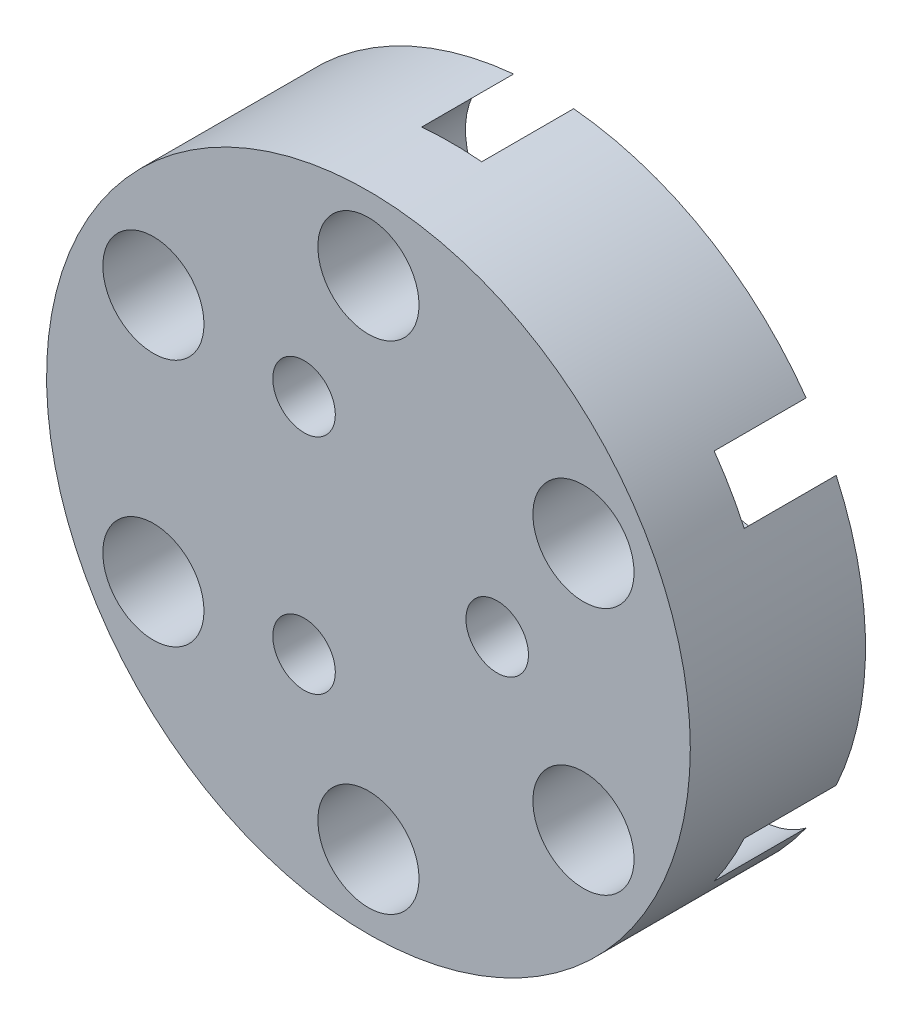
ISO-10303-21;
HEADER;
FILE_DESCRIPTION(('STEP AP214'),'2;1');
FILE_NAME('part.step','',(''),(''),'','','');
FILE_SCHEMA(('AUTOMOTIVE_DESIGN { 1 0 10303 214 1 1 1 1 }'));
ENDSEC;
DATA;
#1=APPLICATION_CONTEXT('core data for automotive mechanical design processes');
#2=APPLICATION_PROTOCOL_DEFINITION('international standard','automotive_design',2000,#1);
#3=PRODUCT_CONTEXT('',#1,'mechanical');
#4=PRODUCT('Part','Part','',(#3));
#5=PRODUCT_RELATED_PRODUCT_CATEGORY('part','',(#4));
#6=PRODUCT_DEFINITION_FORMATION('','',#4);
#7=PRODUCT_DEFINITION_CONTEXT('part definition',#1,'design');
#8=PRODUCT_DEFINITION('design','',#6,#7);
#9=PRODUCT_DEFINITION_SHAPE('','',#8);
#10=(LENGTH_UNIT() NAMED_UNIT(*) SI_UNIT(.MILLI.,.METRE.));
#11=(NAMED_UNIT(*) PLANE_ANGLE_UNIT() SI_UNIT($,.RADIAN.));
#12=(NAMED_UNIT(*) SI_UNIT($,.STERADIAN.) SOLID_ANGLE_UNIT());
#13=UNCERTAINTY_MEASURE_WITH_UNIT(LENGTH_MEASURE(1.E-05),#10,'distance_accuracy_value','');
#14=(GEOMETRIC_REPRESENTATION_CONTEXT(3) GLOBAL_UNCERTAINTY_ASSIGNED_CONTEXT((#13)) GLOBAL_UNIT_ASSIGNED_CONTEXT((#10,
#11,#12)) REPRESENTATION_CONTEXT('',''));
#15=CARTESIAN_POINT('',(0.,0.,0.));
#16=DIRECTION('',(0.,0.,1.));
#17=DIRECTION('',(1.,0.,0.));
#18=AXIS2_PLACEMENT_3D('',#15,#16,#17);
#19=CARTESIAN_POINT('',(11.6913429510902,6.7500000000005,-7.77817459305538));
#20=DIRECTION('',(0.,0.,1.));
#21=DIRECTION('',(1.,0.,0.));
#22=AXIS2_PLACEMENT_3D('',#19,#20,#21);
#23=CYLINDRICAL_SURFACE('',#22,2.75000000000016);
#24=CARTESIAN_POINT('',(11.6913429510902,6.7500000000005,9.525));
#25=DIRECTION('',(0.,0.,1.));
#26=DIRECTION('',(1.,0.,0.));
#27=AXIS2_PLACEMENT_3D('',#24,#25,#26);
#28=CIRCLE('',#27,2.75000000000016);
#29=CARTESIAN_POINT('',(14.4413429510904,6.7500000000005,9.525));
#30=VERTEX_POINT('',#29);
#31=EDGE_CURVE('E241',#30,#30,#28,.T.);
#32=ORIENTED_EDGE('',*,*,#31,.T.);
#33=EDGE_LOOP('',(#32));
#34=FACE_BOUND('',#33,.T.);
#35=CARTESIAN_POINT('',(11.6913429510902,6.7500000000005,5.));
#36=DIRECTION('',(0.,0.,-1.));
#37=DIRECTION('',(-1.,0.,0.));
#38=AXIS2_PLACEMENT_3D('',#35,#36,#37);
#39=CIRCLE('',#38,2.75000000000016);
#40=CARTESIAN_POINT('',(8.94134295109004,6.7500000000005,5.));
#41=VERTEX_POINT('',#40);
#42=EDGE_CURVE('E40',#41,#41,#39,.F.);
#43=ORIENTED_EDGE('',*,*,#42,.F.);
#44=EDGE_LOOP('',(#43));
#45=FACE_BOUND('',#44,.T.);
#46=ADVANCED_FACE('F36',(#34,#45),#23,.F.);
#47=CARTESIAN_POINT('',(11.6913429510908,-6.7499999999995,-7.77817459305538));
#48=DIRECTION('',(0.,0.,1.));
#49=DIRECTION('',(1.,0.,0.));
#50=AXIS2_PLACEMENT_3D('',#47,#48,#49);
#51=CYLINDRICAL_SURFACE('',#50,2.75000000000074);
#52=CARTESIAN_POINT('',(11.6913429510908,-6.7499999999995,9.525));
#53=DIRECTION('',(0.,0.,1.));
#54=DIRECTION('',(1.,0.,0.));
#55=AXIS2_PLACEMENT_3D('',#52,#53,#54);
#56=CIRCLE('',#55,2.75000000000074);
#57=CARTESIAN_POINT('',(14.4413429510915,-6.7499999999995,9.525));
#58=VERTEX_POINT('',#57);
#59=EDGE_CURVE('E247',#58,#58,#56,.T.);
#60=ORIENTED_EDGE('',*,*,#59,.T.);
#61=EDGE_LOOP('',(#60));
#62=FACE_BOUND('',#61,.T.);
#63=CARTESIAN_POINT('',(11.6913429510908,-6.7499999999995,5.));
#64=DIRECTION('',(0.,0.,-1.));
#65=DIRECTION('',(-1.,0.,0.));
#66=AXIS2_PLACEMENT_3D('',#63,#64,#65);
#67=CIRCLE('',#66,2.75000000000074);
#68=CARTESIAN_POINT('',(8.94134295109004,-6.7499999999995,5.));
#69=VERTEX_POINT('',#68);
#70=EDGE_CURVE('E180',#69,#69,#67,.F.);
#71=ORIENTED_EDGE('',*,*,#70,.F.);
#72=EDGE_LOOP('',(#71));
#73=FACE_BOUND('',#72,.T.);
#74=ADVANCED_FACE('F279',(#62,#73),#51,.F.);
#75=CARTESIAN_POINT('',(1.14611941239482E-12,-13.5,-7.77817459305538));
#76=DIRECTION('',(0.,0.,1.));
#77=DIRECTION('',(1.,0.,0.));
#78=AXIS2_PLACEMENT_3D('',#75,#76,#77);
#79=CYLINDRICAL_SURFACE('',#78,2.75000000000119);
#80=CARTESIAN_POINT('',(1.14611941239482E-12,-13.5,9.525));
#81=DIRECTION('',(0.,0.,1.));
#82=DIRECTION('',(1.,0.,0.));
#83=AXIS2_PLACEMENT_3D('',#80,#81,#82);
#84=CIRCLE('',#83,2.75000000000119);
#85=CARTESIAN_POINT('',(2.75000000000233,-13.5,9.525));
#86=VERTEX_POINT('',#85);
#87=EDGE_CURVE('E250',#86,#86,#84,.T.);
#88=ORIENTED_EDGE('',*,*,#87,.T.);
#89=EDGE_LOOP('',(#88));
#90=FACE_BOUND('',#89,.T.);
#91=CARTESIAN_POINT('',(1.14611941239482E-12,-13.5,5.));
#92=DIRECTION('',(0.,0.,-1.));
#93=DIRECTION('',(-1.,0.,0.));
#94=AXIS2_PLACEMENT_3D('',#91,#92,#93);
#95=CIRCLE('',#94,2.75000000000119);
#96=CARTESIAN_POINT('',(-2.75000000000004,-13.5,5.));
#97=VERTEX_POINT('',#96);
#98=EDGE_CURVE('E177',#97,#97,#95,.F.);
#99=ORIENTED_EDGE('',*,*,#98,.F.);
#100=EDGE_LOOP('',(#99));
#101=FACE_BOUND('',#100,.T.);
#102=ADVANCED_FACE('F285',(#90,#101),#79,.F.);
#103=CARTESIAN_POINT('',(-11.6913429510891,-6.7500000000005,-7.77817459305538));
#104=DIRECTION('',(0.,0.,1.));
#105=DIRECTION('',(1.,0.,0.));
#106=AXIS2_PLACEMENT_3D('',#103,#104,#105);
#107=CYLINDRICAL_SURFACE('',#106,2.75000000000109);
#108=CARTESIAN_POINT('',(-11.6913429510891,-6.7500000000005,9.525));
#109=DIRECTION('',(0.,0.,1.));
#110=DIRECTION('',(1.,0.,0.));
#111=AXIS2_PLACEMENT_3D('',#108,#109,#110);
#112=CIRCLE('',#111,2.75000000000109);
#113=CARTESIAN_POINT('',(-8.94134295108797,-6.7500000000005,9.525));
#114=VERTEX_POINT('',#113);
#115=EDGE_CURVE('E244',#114,#114,#112,.T.);
#116=ORIENTED_EDGE('',*,*,#115,.T.);
#117=EDGE_LOOP('',(#116));
#118=FACE_BOUND('',#117,.T.);
#119=CARTESIAN_POINT('',(-11.6913429510891,-6.7500000000005,5.));
#120=DIRECTION('',(0.,0.,-1.));
#121=DIRECTION('',(-1.,0.,0.));
#122=AXIS2_PLACEMENT_3D('',#119,#120,#121);
#123=CIRCLE('',#122,2.75000000000109);
#124=CARTESIAN_POINT('',(-14.4413429510901,-6.7500000000005,5.));
#125=VERTEX_POINT('',#124);
#126=EDGE_CURVE('E173',#125,#125,#123,.F.);
#127=ORIENTED_EDGE('',*,*,#126,.F.);
#128=EDGE_LOOP('',(#127));
#129=FACE_BOUND('',#128,.T.);
#130=ADVANCED_FACE('F255',(#118,#129),#107,.F.);
#131=CARTESIAN_POINT('',(-11.6913429510896,6.7499999999995,-7.77817459305538));
#132=DIRECTION('',(0.,0.,1.));
#133=DIRECTION('',(1.,0.,0.));
#134=AXIS2_PLACEMENT_3D('',#131,#132,#133);
#135=CYLINDRICAL_SURFACE('',#134,2.75000000000058);
#136=CARTESIAN_POINT('',(-11.6913429510896,6.7499999999995,9.525));
#137=DIRECTION('',(0.,0.,1.));
#138=DIRECTION('',(1.,0.,0.));
#139=AXIS2_PLACEMENT_3D('',#136,#137,#138);
#140=CIRCLE('',#139,2.75000000000058);
#141=CARTESIAN_POINT('',(-8.94134295108906,6.7499999999995,9.525));
#142=VERTEX_POINT('',#141);
#143=EDGE_CURVE('E228',#142,#142,#140,.T.);
#144=ORIENTED_EDGE('',*,*,#143,.T.);
#145=EDGE_LOOP('',(#144));
#146=FACE_BOUND('',#145,.T.);
#147=CARTESIAN_POINT('',(-11.6913429510896,6.7499999999995,5.));
#148=DIRECTION('',(0.,0.,-1.));
#149=DIRECTION('',(-1.,0.,0.));
#150=AXIS2_PLACEMENT_3D('',#147,#148,#149);
#151=CIRCLE('',#150,2.75000000000058);
#152=CARTESIAN_POINT('',(-14.4413429510902,6.7499999999995,5.));
#153=VERTEX_POINT('',#152);
#154=EDGE_CURVE('E169',#153,#153,#151,.F.);
#155=ORIENTED_EDGE('',*,*,#154,.F.);
#156=EDGE_LOOP('',(#155));
#157=FACE_BOUND('',#156,.T.);
#158=ADVANCED_FACE('F275',(#146,#157),#135,.F.);
#159=CARTESIAN_POINT('',(0.,13.5,-7.77817459305538));
#160=DIRECTION('',(0.,0.,1.));
#161=DIRECTION('',(1.,0.,0.));
#162=AXIS2_PLACEMENT_3D('',#159,#160,#161);
#163=CYLINDRICAL_SURFACE('',#162,2.75);
#164=CARTESIAN_POINT('',(0.,13.5,9.525));
#165=DIRECTION('',(0.,0.,1.));
#166=DIRECTION('',(1.,0.,0.));
#167=AXIS2_PLACEMENT_3D('',#164,#165,#166);
#168=CIRCLE('',#167,2.75);
#169=CARTESIAN_POINT('',(2.75,13.5,9.525));
#170=VERTEX_POINT('',#169);
#171=EDGE_CURVE('E164',#170,#170,#168,.T.);
#172=ORIENTED_EDGE('',*,*,#171,.T.);
#173=EDGE_LOOP('',(#172));
#174=FACE_BOUND('',#173,.T.);
#175=CARTESIAN_POINT('',(0.,13.5,5.));
#176=DIRECTION('',(0.,0.,-1.));
#177=DIRECTION('',(-1.,0.,0.));
#178=AXIS2_PLACEMENT_3D('',#175,#176,#177);
#179=CIRCLE('',#178,2.75);
#180=CARTESIAN_POINT('',(-2.75,13.5,5.));
#181=VERTEX_POINT('',#180);
#182=EDGE_CURVE('E166',#181,#181,#179,.F.);
#183=ORIENTED_EDGE('',*,*,#182,.F.);
#184=EDGE_LOOP('',(#183));
#185=FACE_BOUND('',#184,.T.);
#186=ADVANCED_FACE('F271',(#174,#185),#163,.F.);
#187=CARTESIAN_POINT('',(0.,0.,9.525));
#188=DIRECTION('',(0.,0.,-1.));
#189=DIRECTION('',(-1.,0.,0.));
#190=AXIS2_PLACEMENT_3D('',#187,#188,#189);
#191=CYLINDRICAL_SURFACE('',#190,17.5);
#192=CARTESIAN_POINT('',(0.,0.,0.));
#193=DIRECTION('',(0.,0.,1.));
#194=DIRECTION('',(1.,0.,0.));
#195=AXIS2_PLACEMENT_3D('',#192,#193,#194);
#196=CIRCLE('',#195,17.5);
#197=CARTESIAN_POINT('',(-1.63333274281926,17.4236111111111,0.));
#198=VERTEX_POINT('',#197);
#199=CARTESIAN_POINT('',(-14.2726234764723,10.1263132036715,0.));
#200=VERTEX_POINT('',#199);
#201=EDGE_CURVE('E148',#198,#200,#196,.T.);
#202=ORIENTED_EDGE('',*,*,#201,.T.);
#203=DIRECTION('',(0.,0.,-1.));
#204=VECTOR('',#203,1.);
#205=CARTESIAN_POINT('',(-14.2726234764723,10.1263132036715,2.5));
#206=LINE('',#205,#204);
#207=CARTESIAN_POINT('',(-14.2726234764723,10.1263132036715,5.));
#208=VERTEX_POINT('',#207);
#209=EDGE_CURVE('E218',#200,#208,#206,.F.);
#210=ORIENTED_EDGE('',*,*,#209,.T.);
#211=CARTESIAN_POINT('',(0.,0.,5.));
#212=DIRECTION('',(0.,0.,-1.));
#213=DIRECTION('',(-1.,0.,0.));
#214=AXIS2_PLACEMENT_3D('',#211,#212,#213);
#215=CIRCLE('',#214,17.5);
#216=CARTESIAN_POINT('',(-15.9059562192931,7.2972979074401,5.));
#217=VERTEX_POINT('',#216);
#218=EDGE_CURVE('E172',#217,#208,#215,.T.);
#219=ORIENTED_EDGE('',*,*,#218,.F.);
#220=DIRECTION('',(0.,0.,-1.));
#221=VECTOR('',#220,1.);
#222=CARTESIAN_POINT('',(-15.9059562192931,7.29729790744013,2.5));
#223=LINE('',#222,#221);
#224=CARTESIAN_POINT('',(-15.9059562192931,7.29729790744013,0.));
#225=VERTEX_POINT('',#224);
#226=EDGE_CURVE('E215',#217,#225,#223,.T.);
#227=ORIENTED_EDGE('',*,*,#226,.T.);
#228=CARTESIAN_POINT('',(-15.9059562192938,-7.29729790743877,0.));
#229=VERTEX_POINT('',#228);
#230=EDGE_CURVE('E156',#225,#229,#196,.T.);
#231=ORIENTED_EDGE('',*,*,#230,.T.);
#232=DIRECTION('',(0.,0.,-1.));
#233=VECTOR('',#232,1.);
#234=CARTESIAN_POINT('',(-15.9059562192938,-7.29729790743877,2.5));
#235=LINE('',#234,#233);
#236=CARTESIAN_POINT('',(-15.9059562192938,-7.29729790743875,5.));
#237=VERTEX_POINT('',#236);
#238=EDGE_CURVE('E212',#229,#237,#235,.F.);
#239=ORIENTED_EDGE('',*,*,#238,.T.);
#240=CARTESIAN_POINT('',(0.,0.,5.));
#241=DIRECTION('',(0.,0.,-1.));
#242=DIRECTION('',(-1.,0.,0.));
#243=AXIS2_PLACEMENT_3D('',#240,#241,#242);
#244=CIRCLE('',#243,17.5);
#245=CARTESIAN_POINT('',(-14.2726234764732,-10.1263132036703,5.));
#246=VERTEX_POINT('',#245);
#247=EDGE_CURVE('E176',#246,#237,#244,.T.);
#248=ORIENTED_EDGE('',*,*,#247,.F.);
#249=DIRECTION('',(0.,0.,-1.));
#250=VECTOR('',#249,1.);
#251=CARTESIAN_POINT('',(-14.2726234764732,-10.1263132036703,2.5));
#252=LINE('',#251,#250);
#253=CARTESIAN_POINT('',(-14.2726234764732,-10.1263132036703,0.));
#254=VERTEX_POINT('',#253);
#255=EDGE_CURVE('E209',#246,#254,#252,.T.);
#256=ORIENTED_EDGE('',*,*,#255,.T.);
#257=CARTESIAN_POINT('',(-1.63333274282074,-17.423611111111,0.));
#258=VERTEX_POINT('',#257);
#259=EDGE_CURVE('E160',#254,#258,#196,.T.);
#260=ORIENTED_EDGE('',*,*,#259,.T.);
#261=DIRECTION('',(0.,0.,-1.));
#262=VECTOR('',#261,1.);
#263=CARTESIAN_POINT('',(-1.63333274282073,-17.423611111111,2.5));
#264=LINE('',#263,#262);
#265=CARTESIAN_POINT('',(-1.63333274282073,-17.423611111111,5.));
#266=VERTEX_POINT('',#265);
#267=EDGE_CURVE('E61',#258,#266,#264,.F.);
#268=ORIENTED_EDGE('',*,*,#267,.T.);
#269=CARTESIAN_POINT('',(0.,0.,5.));
#270=DIRECTION('',(0.,0.,-1.));
#271=DIRECTION('',(-1.,0.,0.));
#272=AXIS2_PLACEMENT_3D('',#269,#270,#271);
#273=CIRCLE('',#272,17.5);
#274=CARTESIAN_POINT('',(1.63333274281777,-17.4236111111112,5.));
#275=VERTEX_POINT('',#274);
#276=EDGE_CURVE('E179',#275,#266,#273,.T.);
#277=ORIENTED_EDGE('',*,*,#276,.F.);
#278=DIRECTION('',(0.,0.,-1.));
#279=VECTOR('',#278,1.);
#280=CARTESIAN_POINT('',(1.63333274281778,-17.4236111111112,2.5));
#281=LINE('',#280,#279);
#282=CARTESIAN_POINT('',(1.63333274281778,-17.4236111111112,0.));
#283=VERTEX_POINT('',#282);
#284=EDGE_CURVE('E205',#275,#283,#281,.T.);
#285=ORIENTED_EDGE('',*,*,#284,.T.);
#286=CARTESIAN_POINT('',(14.2726234764737,-10.1263132036696,0.));
#287=VERTEX_POINT('',#286);
#288=EDGE_CURVE('E163',#283,#287,#196,.T.);
#289=ORIENTED_EDGE('',*,*,#288,.T.);
#290=DIRECTION('',(0.,0.,-1.));
#291=VECTOR('',#290,1.);
#292=CARTESIAN_POINT('',(14.2726234764737,-10.1263132036696,2.5));
#293=LINE('',#292,#291);
#294=CARTESIAN_POINT('',(14.2726234764737,-10.1263132036696,5.));
#295=VERTEX_POINT('',#294);
#296=EDGE_CURVE('E53',#287,#295,#293,.F.);
#297=ORIENTED_EDGE('',*,*,#296,.T.);
#298=CARTESIAN_POINT('',(0.,0.,5.));
#299=DIRECTION('',(0.,0.,-1.));
#300=DIRECTION('',(-1.,0.,0.));
#301=AXIS2_PLACEMENT_3D('',#298,#299,#300);
#302=CIRCLE('',#301,17.5);
#303=CARTESIAN_POINT('',(15.9059562192915,-7.29729790744359,5.));
#304=VERTEX_POINT('',#303);
#305=EDGE_CURVE('E182',#304,#295,#302,.T.);
#306=ORIENTED_EDGE('',*,*,#305,.F.);
#307=DIRECTION('',(0.,0.,-1.));
#308=VECTOR('',#307,1.);
#309=CARTESIAN_POINT('',(15.9059562192915,-7.29729790744361,2.5));
#310=LINE('',#309,#308);
#311=CARTESIAN_POINT('',(15.9059562192915,-7.29729790744361,0.));
#312=VERTEX_POINT('',#311);
#313=EDGE_CURVE('E201',#304,#312,#310,.T.);
#314=ORIENTED_EDGE('',*,*,#313,.T.);
#315=CARTESIAN_POINT('',(15.9059562192922,7.29729790744221,0.));
#316=VERTEX_POINT('',#315);
#317=EDGE_CURVE('E158',#312,#316,#196,.T.);
#318=ORIENTED_EDGE('',*,*,#317,.T.);
#319=DIRECTION('',(0.,0.,-1.));
#320=VECTOR('',#319,1.);
#321=CARTESIAN_POINT('',(15.9059562192922,7.29729790744221,2.5));
#322=LINE('',#321,#320);
#323=CARTESIAN_POINT('',(15.9059562192922,7.29729790744222,5.));
#324=VERTEX_POINT('',#323);
#325=EDGE_CURVE('E198',#316,#324,#322,.F.);
#326=ORIENTED_EDGE('',*,*,#325,.T.);
#327=CARTESIAN_POINT('',(0.,0.,5.));
#328=DIRECTION('',(0.,0.,-1.));
#329=DIRECTION('',(-1.,0.,0.));
#330=AXIS2_PLACEMENT_3D('',#327,#328,#329);
#331=CIRCLE('',#330,17.5);
#332=CARTESIAN_POINT('',(14.2726234764745,10.1263132036684,5.));
#333=VERTEX_POINT('',#332);
#334=EDGE_CURVE('E150',#333,#324,#331,.T.);
#335=ORIENTED_EDGE('',*,*,#334,.F.);
#336=DIRECTION('',(0.,0.,-1.));
#337=VECTOR('',#336,1.);
#338=CARTESIAN_POINT('',(14.2726234764745,10.1263132036684,2.5));
#339=LINE('',#338,#337);
#340=CARTESIAN_POINT('',(14.2726234764745,10.1263132036684,0.));
#341=VERTEX_POINT('',#340);
#342=EDGE_CURVE('E195',#333,#341,#339,.T.);
#343=ORIENTED_EDGE('',*,*,#342,.T.);
#344=CARTESIAN_POINT('',(1.63333274281926,17.4236111111111,0.));
#345=VERTEX_POINT('',#344);
#346=EDGE_CURVE('E45',#341,#345,#196,.T.);
#347=ORIENTED_EDGE('',*,*,#346,.T.);
#348=DIRECTION('',(0.,0.,-1.));
#349=VECTOR('',#348,1.);
#350=CARTESIAN_POINT('',(1.63333274281926,17.4236111111111,2.5));
#351=LINE('',#350,#349);
#352=CARTESIAN_POINT('',(1.63333274281925,17.4236111111111,5.));
#353=VERTEX_POINT('',#352);
#354=EDGE_CURVE('E135',#345,#353,#351,.F.);
#355=ORIENTED_EDGE('',*,*,#354,.T.);
#356=CARTESIAN_POINT('',(0.,0.,5.));
#357=DIRECTION('',(0.,0.,-1.));
#358=DIRECTION('',(-1.,0.,0.));
#359=AXIS2_PLACEMENT_3D('',#356,#357,#358);
#360=CIRCLE('',#359,17.5);
#361=CARTESIAN_POINT('',(-1.63333274281925,17.4236111111111,5.));
#362=VERTEX_POINT('',#361);
#363=EDGE_CURVE('E149',#362,#353,#360,.T.);
#364=ORIENTED_EDGE('',*,*,#363,.F.);
#365=DIRECTION('',(0.,0.,-1.));
#366=VECTOR('',#365,1.);
#367=CARTESIAN_POINT('',(-1.63333274281926,17.4236111111111,2.5));
#368=LINE('',#367,#366);
#369=EDGE_CURVE('E132',#362,#198,#368,.T.);
#370=ORIENTED_EDGE('',*,*,#369,.T.);
#371=EDGE_LOOP('',(#202,#210,#219,#227,#231,#239,#248,#256,#260,#268,#277,#285,#289,#297,#306,
#314,#318,#326,#335,#343,#347,#355,#364,#370));
#372=FACE_BOUND('',#371,.T.);
#373=CARTESIAN_POINT('',(0.,0.,9.525));
#374=DIRECTION('',(0.,0.,1.));
#375=DIRECTION('',(1.,0.,0.));
#376=AXIS2_PLACEMENT_3D('',#373,#374,#375);
#377=CIRCLE('',#376,17.5);
#378=CARTESIAN_POINT('',(17.5,0.,9.525));
#379=VERTEX_POINT('',#378);
#380=EDGE_CURVE('E11',#379,#379,#377,.T.);
#381=ORIENTED_EDGE('',*,*,#380,.F.);
#382=EDGE_LOOP('',(#381));
#383=FACE_BOUND('',#382,.T.);
#384=ADVANCED_FACE('F38',(#372,#383),#191,.T.);
#385=CARTESIAN_POINT('',(0.,0.,9.525));
#386=DIRECTION('',(0.,0.,1.));
#387=DIRECTION('',(1.,0.,0.));
#388=AXIS2_PLACEMENT_3D('',#385,#386,#387);
#389=PLANE('',#388);
#390=CARTESIAN_POINT('',(-3.50000000000003,6.06217782649105,9.525));
#391=DIRECTION('',(0.,0.,1.));
#392=DIRECTION('',(1.,0.,0.));
#393=AXIS2_PLACEMENT_3D('',#390,#391,#392);
#394=CIRCLE('',#393,1.7);
#395=CARTESIAN_POINT('',(-1.80000000000003,6.06217782649105,9.525));
#396=VERTEX_POINT('',#395);
#397=EDGE_CURVE('E221',#396,#396,#394,.T.);
#398=ORIENTED_EDGE('',*,*,#397,.F.);
#399=EDGE_LOOP('',(#398));
#400=FACE_BOUND('',#399,.T.);
#401=CARTESIAN_POINT('',(7.00000000000035,6.26181982168105E-13,9.525));
#402=DIRECTION('',(0.,0.,1.));
#403=DIRECTION('',(1.,0.,0.));
#404=AXIS2_PLACEMENT_3D('',#401,#402,#403);
#405=CIRCLE('',#404,1.7);
#406=CARTESIAN_POINT('',(8.70000000000035,6.26181982168105E-13,9.525));
#407=VERTEX_POINT('',#406);
#408=EDGE_CURVE('E229',#407,#407,#405,.T.);
#409=ORIENTED_EDGE('',*,*,#408,.F.);
#410=EDGE_LOOP('',(#409));
#411=FACE_BOUND('',#410,.T.);
#412=CARTESIAN_POINT('',(-3.49999999999928,-6.06217782649109,9.525));
#413=DIRECTION('',(0.,0.,1.));
#414=DIRECTION('',(1.,0.,0.));
#415=AXIS2_PLACEMENT_3D('',#412,#413,#414);
#416=CIRCLE('',#415,1.7);
#417=CARTESIAN_POINT('',(-1.79999999999928,-6.06217782649109,9.525));
#418=VERTEX_POINT('',#417);
#419=EDGE_CURVE('E220',#418,#418,#416,.T.);
#420=ORIENTED_EDGE('',*,*,#419,.F.);
#421=EDGE_LOOP('',(#420));
#422=FACE_BOUND('',#421,.T.);
#423=ORIENTED_EDGE('',*,*,#171,.F.);
#424=EDGE_LOOP('',(#423));
#425=FACE_BOUND('',#424,.T.);
#426=ORIENTED_EDGE('',*,*,#143,.F.);
#427=EDGE_LOOP('',(#426));
#428=FACE_BOUND('',#427,.T.);
#429=ORIENTED_EDGE('',*,*,#115,.F.);
#430=EDGE_LOOP('',(#429));
#431=FACE_BOUND('',#430,.T.);
#432=ORIENTED_EDGE('',*,*,#87,.F.);
#433=EDGE_LOOP('',(#432));
#434=FACE_BOUND('',#433,.T.);
#435=ORIENTED_EDGE('',*,*,#59,.F.);
#436=EDGE_LOOP('',(#435));
#437=FACE_BOUND('',#436,.T.);
#438=ORIENTED_EDGE('',*,*,#31,.F.);
#439=EDGE_LOOP('',(#438));
#440=FACE_BOUND('',#439,.T.);
#441=ORIENTED_EDGE('',*,*,#380,.T.);
#442=EDGE_LOOP('',(#441));
#443=FACE_BOUND('',#442,.T.);
#444=ADVANCED_FACE('F258',(#400,#411,#422,#425,#428,#431,#434,#437,#440,#443),#389,.T.);
#445=CARTESIAN_POINT('',(0.,0.,0.));
#446=DIRECTION('',(0.,0.,1.));
#447=DIRECTION('',(1.,0.,0.));
#448=AXIS2_PLACEMENT_3D('',#445,#446,#447);
#449=PLANE('',#448);
#450=CARTESIAN_POINT('',(-3.50000000000003,6.06217782649105,0.));
#451=DIRECTION('',(0.,0.,1.));
#452=DIRECTION('',(1.,0.,0.));
#453=AXIS2_PLACEMENT_3D('',#450,#451,#452);
#454=CIRCLE('',#453,1.7);
#455=CARTESIAN_POINT('',(-1.80000000000003,6.06217782649105,0.));
#456=VERTEX_POINT('',#455);
#457=EDGE_CURVE('E224',#456,#456,#454,.F.);
#458=ORIENTED_EDGE('',*,*,#457,.F.);
#459=EDGE_LOOP('',(#458));
#460=FACE_BOUND('',#459,.T.);
#461=CARTESIAN_POINT('',(7.00000000000035,6.26181982168105E-13,0.));
#462=DIRECTION('',(0.,0.,1.));
#463=DIRECTION('',(1.,0.,0.));
#464=AXIS2_PLACEMENT_3D('',#461,#462,#463);
#465=CIRCLE('',#464,1.7);
#466=CARTESIAN_POINT('',(8.70000000000035,6.26181982168105E-13,0.));
#467=VERTEX_POINT('',#466);
#468=EDGE_CURVE('E225',#467,#467,#465,.F.);
#469=ORIENTED_EDGE('',*,*,#468,.F.);
#470=EDGE_LOOP('',(#469));
#471=FACE_BOUND('',#470,.T.);
#472=CARTESIAN_POINT('',(-3.49999999999928,-6.06217782649109,0.));
#473=DIRECTION('',(0.,0.,1.));
#474=DIRECTION('',(1.,0.,0.));
#475=AXIS2_PLACEMENT_3D('',#472,#473,#474);
#476=CIRCLE('',#475,1.7);
#477=CARTESIAN_POINT('',(-1.79999999999928,-6.06217782649109,0.));
#478=VERTEX_POINT('',#477);
#479=EDGE_CURVE('E232',#478,#478,#476,.F.);
#480=ORIENTED_EDGE('',*,*,#479,.F.);
#481=EDGE_LOOP('',(#480));
#482=FACE_BOUND('',#481,.T.);
#483=ORIENTED_EDGE('',*,*,#230,.F.);
#484=CARTESIAN_POINT('',(-11.6913429510902,6.7500000000005,0.));
#485=DIRECTION('',(0.,0.,-1.));
#486=DIRECTION('',(-1.,0.,0.));
#487=AXIS2_PLACEMENT_3D('',#484,#485,#486);
#488=CIRCLE('',#487,4.25);
#489=EDGE_CURVE('E155',#200,#225,#488,.T.);
#490=ORIENTED_EDGE('',*,*,#489,.F.);
#491=ORIENTED_EDGE('',*,*,#201,.F.);
#492=CARTESIAN_POINT('',(0.,13.5,0.));
#493=DIRECTION('',(0.,0.,-1.));
#494=DIRECTION('',(-1.,0.,0.));
#495=AXIS2_PLACEMENT_3D('',#492,#493,#494);
#496=CIRCLE('',#495,4.25);
#497=EDGE_CURVE('E128',#345,#198,#496,.T.);
#498=ORIENTED_EDGE('',*,*,#497,.F.);
#499=ORIENTED_EDGE('',*,*,#346,.F.);
#500=CARTESIAN_POINT('',(11.6913429510896,6.7499999999995,0.));
#501=DIRECTION('',(0.,0.,-1.));
#502=DIRECTION('',(-1.,0.,0.));
#503=AXIS2_PLACEMENT_3D('',#500,#501,#502);
#504=CIRCLE('',#503,4.25);
#505=EDGE_CURVE('E335',#316,#341,#504,.T.);
#506=ORIENTED_EDGE('',*,*,#505,.F.);
#507=ORIENTED_EDGE('',*,*,#317,.F.);
#508=CARTESIAN_POINT('',(11.6913429510891,-6.7500000000005,0.));
#509=DIRECTION('',(0.,0.,-1.));
#510=DIRECTION('',(-1.,0.,0.));
#511=AXIS2_PLACEMENT_3D('',#508,#509,#510);
#512=CIRCLE('',#511,4.25);
#513=EDGE_CURVE('E349',#287,#312,#512,.T.);
#514=ORIENTED_EDGE('',*,*,#513,.F.);
#515=ORIENTED_EDGE('',*,*,#288,.F.);
#516=CARTESIAN_POINT('',(-1.14611941239482E-12,-13.5,0.));
#517=DIRECTION('',(0.,0.,-1.));
#518=DIRECTION('',(-1.,0.,0.));
#519=AXIS2_PLACEMENT_3D('',#516,#517,#518);
#520=CIRCLE('',#519,4.25);
#521=EDGE_CURVE('E344',#258,#283,#520,.T.);
#522=ORIENTED_EDGE('',*,*,#521,.F.);
#523=ORIENTED_EDGE('',*,*,#259,.F.);
#524=CARTESIAN_POINT('',(-11.6913429510908,-6.7499999999995,0.));
#525=DIRECTION('',(0.,0.,-1.));
#526=DIRECTION('',(-1.,0.,0.));
#527=AXIS2_PLACEMENT_3D('',#524,#525,#526);
#528=CIRCLE('',#527,4.25);
#529=EDGE_CURVE('E340',#229,#254,#528,.T.);
#530=ORIENTED_EDGE('',*,*,#529,.F.);
#531=EDGE_LOOP('',(#483,#490,#491,#498,#499,#506,#507,#514,#515,#522,#523,#530));
#532=FACE_BOUND('',#531,.T.);
#533=ADVANCED_FACE('F154',(#460,#471,#482,#532),#449,.F.);
#534=CARTESIAN_POINT('',(-3.49999999999928,-6.06217782649109,-4.80832611206852));
#535=DIRECTION('',(0.,0.,1.));
#536=DIRECTION('',(1.,0.,0.));
#537=AXIS2_PLACEMENT_3D('',#534,#535,#536);
#538=CYLINDRICAL_SURFACE('',#537,1.7);
#539=CARTESIAN_POINT('',(-1.79999999999928,-6.06217782649109,0.));
#540=CARTESIAN_POINT('',(-1.79999999999928,-6.06217782649109,0.0992187499999992));
#541=CARTESIAN_POINT('',(-1.79999999999928,-6.06217782649109,0.198437499999999));
#542=CARTESIAN_POINT('',(-1.79999999999928,-6.06217782649109,0.396874999999999));
#543=CARTESIAN_POINT('',(-1.79999999999928,-6.06217782649109,0.496093749999999));
#544=CARTESIAN_POINT('',(-1.79999999999928,-6.06217782649109,0.694531249999999));
#545=CARTESIAN_POINT('',(-1.79999999999928,-6.06217782649109,0.79375));
#546=CARTESIAN_POINT('',(-1.79999999999928,-6.06217782649109,0.9921875));
#547=CARTESIAN_POINT('',(-1.79999999999928,-6.06217782649109,1.09140625));
#548=CARTESIAN_POINT('',(-1.79999999999928,-6.06217782649109,1.28984375));
#549=CARTESIAN_POINT('',(-1.79999999999928,-6.06217782649109,1.3890625));
#550=CARTESIAN_POINT('',(-1.79999999999928,-6.06217782649109,1.5875));
#551=CARTESIAN_POINT('',(-1.79999999999928,-6.06217782649109,1.68671875));
#552=CARTESIAN_POINT('',(-1.79999999999928,-6.06217782649109,1.88515625));
#553=CARTESIAN_POINT('',(-1.79999999999928,-6.06217782649109,1.984375));
#554=CARTESIAN_POINT('',(-1.79999999999928,-6.06217782649109,2.1828125));
#555=CARTESIAN_POINT('',(-1.79999999999928,-6.06217782649109,2.28203125));
#556=CARTESIAN_POINT('',(-1.79999999999928,-6.06217782649109,2.48046875));
#557=CARTESIAN_POINT('',(-1.79999999999928,-6.06217782649109,2.5796875));
#558=CARTESIAN_POINT('',(-1.79999999999928,-6.06217782649109,2.778125));
#559=CARTESIAN_POINT('',(-1.79999999999928,-6.06217782649109,2.87734375));
#560=CARTESIAN_POINT('',(-1.79999999999928,-6.06217782649109,3.07578125));
#561=CARTESIAN_POINT('',(-1.79999999999928,-6.06217782649109,3.175));
#562=CARTESIAN_POINT('',(-1.79999999999928,-6.06217782649109,3.3734375));
#563=CARTESIAN_POINT('',(-1.79999999999928,-6.06217782649109,3.47265625));
#564=CARTESIAN_POINT('',(-1.79999999999928,-6.06217782649109,3.67109375));
#565=CARTESIAN_POINT('',(-1.79999999999928,-6.06217782649109,3.7703125));
#566=CARTESIAN_POINT('',(-1.79999999999928,-6.06217782649109,3.96875));
#567=CARTESIAN_POINT('',(-1.79999999999928,-6.06217782649109,4.06796875));
#568=CARTESIAN_POINT('',(-1.79999999999928,-6.06217782649109,4.26640625));
#569=CARTESIAN_POINT('',(-1.79999999999928,-6.06217782649109,4.365625));
#570=CARTESIAN_POINT('',(-1.79999999999928,-6.06217782649109,4.5640625));
#571=CARTESIAN_POINT('',(-1.79999999999928,-6.06217782649109,4.66328125));
#572=CARTESIAN_POINT('',(-1.79999999999928,-6.06217782649109,4.86171875));
#573=CARTESIAN_POINT('',(-1.79999999999928,-6.06217782649109,4.9609375));
#574=CARTESIAN_POINT('',(-1.79999999999928,-6.06217782649109,5.159375));
#575=CARTESIAN_POINT('',(-1.79999999999928,-6.06217782649109,5.25859375));
#576=CARTESIAN_POINT('',(-1.79999999999928,-6.06217782649109,5.45703125));
#577=CARTESIAN_POINT('',(-1.79999999999928,-6.06217782649109,5.55625));
#578=CARTESIAN_POINT('',(-1.79999999999928,-6.06217782649109,5.7546875));
#579=CARTESIAN_POINT('',(-1.79999999999928,-6.06217782649109,5.85390625));
#580=CARTESIAN_POINT('',(-1.79999999999928,-6.06217782649109,6.05234375));
#581=CARTESIAN_POINT('',(-1.79999999999928,-6.06217782649109,6.1515625));
#582=CARTESIAN_POINT('',(-1.79999999999928,-6.06217782649109,6.35));
#583=CARTESIAN_POINT('',(-1.79999999999928,-6.06217782649109,6.44921875));
#584=CARTESIAN_POINT('',(-1.79999999999928,-6.06217782649109,6.64765625));
#585=CARTESIAN_POINT('',(-1.79999999999928,-6.06217782649109,6.746875));
#586=CARTESIAN_POINT('',(-1.79999999999928,-6.06217782649109,6.9453125));
#587=CARTESIAN_POINT('',(-1.79999999999928,-6.06217782649109,7.04453125));
#588=CARTESIAN_POINT('',(-1.79999999999928,-6.06217782649109,7.24296875));
#589=CARTESIAN_POINT('',(-1.79999999999928,-6.06217782649109,7.3421875));
#590=CARTESIAN_POINT('',(-1.79999999999928,-6.06217782649109,7.540625));
#591=CARTESIAN_POINT('',(-1.79999999999928,-6.06217782649109,7.63984375));
#592=CARTESIAN_POINT('',(-1.79999999999928,-6.06217782649109,7.83828125));
#593=CARTESIAN_POINT('',(-1.79999999999928,-6.06217782649109,7.9375));
#594=CARTESIAN_POINT('',(-1.79999999999928,-6.06217782649109,8.1359375));
#595=CARTESIAN_POINT('',(-1.79999999999928,-6.06217782649109,8.23515625));
#596=CARTESIAN_POINT('',(-1.79999999999928,-6.06217782649109,8.43359375));
#597=CARTESIAN_POINT('',(-1.79999999999928,-6.06217782649109,8.5328125));
#598=CARTESIAN_POINT('',(-1.79999999999928,-6.06217782649109,8.73125));
#599=CARTESIAN_POINT('',(-1.79999999999928,-6.06217782649109,8.83046875));
#600=CARTESIAN_POINT('',(-1.79999999999928,-6.06217782649109,9.02890625));
#601=CARTESIAN_POINT('',(-1.79999999999928,-6.06217782649109,9.128125));
#602=CARTESIAN_POINT('',(-1.79999999999928,-6.06217782649109,9.3265625));
#603=CARTESIAN_POINT('',(-1.79999999999928,-6.06217782649109,9.42578125));
#604=CARTESIAN_POINT('',(-1.79999999999928,-6.06217782649109,9.525));
#605=B_SPLINE_CURVE_WITH_KNOTS('',3,(#539,#540,#541,#542,#543,#544,#545,#546,#547,#548,#549,
#550,#551,#552,#553,#554,#555,#556,#557,#558,#559,#560,#561,#562,#563,#564,#565,#566,#567,#568,
#569,#570,#571,#572,#573,#574,#575,#576,#577,#578,#579,#580,#581,#582,#583,#584,#585,#586,#587,
#588,#589,#590,#591,#592,#593,#594,#595,#596,#597,#598,#599,#600,#601,#602,#603,#604),
.UNSPECIFIED.,.F.,.F.,(4,2,2,2,2,2,2,2,2,2,2,2,2,2,2,2,2,2,2,2,2,2,2,2,2,2,2,2,2,2,2,2,4),(0.,
0.29765625,0.5953125,0.892968750000001,1.190625,1.48828125,1.7859375,2.08359375,2.38125,
2.67890625,2.9765625,3.27421875,3.571875,3.86953125,4.1671875,4.46484375,4.7625,5.06015625,
5.3578125,5.65546875,5.953125,6.25078125,6.5484375,6.84609375,7.14375,7.44140625,7.7390625,
8.03671875,8.334375,8.63203125,8.9296875,9.22734375,9.525),.UNSPECIFIED.);
#606=EDGE_CURVE('BSEAM296',#478,#418,#605,.T.);
#607=ORIENTED_EDGE('',*,*,#479,.T.);
#608=ORIENTED_EDGE('',*,*,#419,.T.);
#609=ORIENTED_EDGE('',*,*,#606,.T.);
#610=ORIENTED_EDGE('',*,*,#606,.F.);
#611=EDGE_LOOP('',(#607,#609,#608,#610));
#612=FACE_BOUND('',#611,.T.);
#613=ADVANCED_FACE('F296',(#612),#538,.F.);
#614=CARTESIAN_POINT('',(7.00000000000035,6.26181982168105E-13,-4.80832611206852));
#615=DIRECTION('',(0.,0.,1.));
#616=DIRECTION('',(1.,0.,0.));
#617=AXIS2_PLACEMENT_3D('',#614,#615,#616);
#618=CYLINDRICAL_SURFACE('',#617,1.7);
#619=CARTESIAN_POINT('',(8.70000000000035,6.26181982168105E-13,0.));
#620=CARTESIAN_POINT('',(8.70000000000035,6.26181982168105E-13,0.0992187499999992));
#621=CARTESIAN_POINT('',(8.70000000000035,6.26181982168105E-13,0.198437499999999));
#622=CARTESIAN_POINT('',(8.70000000000035,6.26181982168105E-13,0.396874999999999));
#623=CARTESIAN_POINT('',(8.70000000000035,6.26181982168105E-13,0.496093749999999));
#624=CARTESIAN_POINT('',(8.70000000000035,6.26181982168105E-13,0.694531249999999));
#625=CARTESIAN_POINT('',(8.70000000000035,6.26181982168105E-13,0.79375));
#626=CARTESIAN_POINT('',(8.70000000000035,6.26181982168105E-13,0.9921875));
#627=CARTESIAN_POINT('',(8.70000000000035,6.26181982168105E-13,1.09140625));
#628=CARTESIAN_POINT('',(8.70000000000035,6.26181982168105E-13,1.28984375));
#629=CARTESIAN_POINT('',(8.70000000000035,6.26181982168105E-13,1.3890625));
#630=CARTESIAN_POINT('',(8.70000000000035,6.26181982168105E-13,1.5875));
#631=CARTESIAN_POINT('',(8.70000000000035,6.26181982168105E-13,1.68671875));
#632=CARTESIAN_POINT('',(8.70000000000035,6.26181982168105E-13,1.88515625));
#633=CARTESIAN_POINT('',(8.70000000000035,6.26181982168105E-13,1.984375));
#634=CARTESIAN_POINT('',(8.70000000000035,6.26181982168105E-13,2.1828125));
#635=CARTESIAN_POINT('',(8.70000000000035,6.26181982168105E-13,2.28203125));
#636=CARTESIAN_POINT('',(8.70000000000035,6.26181982168105E-13,2.48046875));
#637=CARTESIAN_POINT('',(8.70000000000035,6.26181982168105E-13,2.5796875));
#638=CARTESIAN_POINT('',(8.70000000000035,6.26181982168105E-13,2.778125));
#639=CARTESIAN_POINT('',(8.70000000000035,6.26181982168105E-13,2.87734375));
#640=CARTESIAN_POINT('',(8.70000000000035,6.26181982168105E-13,3.07578125));
#641=CARTESIAN_POINT('',(8.70000000000035,6.26181982168105E-13,3.175));
#642=CARTESIAN_POINT('',(8.70000000000035,6.26181982168105E-13,3.3734375));
#643=CARTESIAN_POINT('',(8.70000000000035,6.26181982168105E-13,3.47265625));
#644=CARTESIAN_POINT('',(8.70000000000035,6.26181982168105E-13,3.67109375));
#645=CARTESIAN_POINT('',(8.70000000000035,6.26181982168105E-13,3.7703125));
#646=CARTESIAN_POINT('',(8.70000000000035,6.26181982168105E-13,3.96875));
#647=CARTESIAN_POINT('',(8.70000000000035,6.26181982168105E-13,4.06796875));
#648=CARTESIAN_POINT('',(8.70000000000035,6.26181982168105E-13,4.26640625));
#649=CARTESIAN_POINT('',(8.70000000000035,6.26181982168105E-13,4.365625));
#650=CARTESIAN_POINT('',(8.70000000000035,6.26181982168105E-13,4.5640625));
#651=CARTESIAN_POINT('',(8.70000000000035,6.26181982168105E-13,4.66328125));
#652=CARTESIAN_POINT('',(8.70000000000035,6.26181982168105E-13,4.86171875));
#653=CARTESIAN_POINT('',(8.70000000000035,6.26181982168105E-13,4.9609375));
#654=CARTESIAN_POINT('',(8.70000000000035,6.26181982168105E-13,5.159375));
#655=CARTESIAN_POINT('',(8.70000000000035,6.26181982168105E-13,5.25859375));
#656=CARTESIAN_POINT('',(8.70000000000035,6.26181982168105E-13,5.45703125));
#657=CARTESIAN_POINT('',(8.70000000000035,6.26181982168105E-13,5.55625));
#658=CARTESIAN_POINT('',(8.70000000000035,6.26181982168105E-13,5.7546875));
#659=CARTESIAN_POINT('',(8.70000000000035,6.26181982168105E-13,5.85390625));
#660=CARTESIAN_POINT('',(8.70000000000035,6.26181982168105E-13,6.05234375));
#661=CARTESIAN_POINT('',(8.70000000000035,6.26181982168105E-13,6.1515625));
#662=CARTESIAN_POINT('',(8.70000000000035,6.26181982168105E-13,6.35));
#663=CARTESIAN_POINT('',(8.70000000000035,6.26181982168105E-13,6.44921875));
#664=CARTESIAN_POINT('',(8.70000000000035,6.26181982168105E-13,6.64765625));
#665=CARTESIAN_POINT('',(8.70000000000035,6.26181982168105E-13,6.746875));
#666=CARTESIAN_POINT('',(8.70000000000035,6.26181982168105E-13,6.9453125));
#667=CARTESIAN_POINT('',(8.70000000000035,6.26181982168105E-13,7.04453125));
#668=CARTESIAN_POINT('',(8.70000000000035,6.26181982168105E-13,7.24296875));
#669=CARTESIAN_POINT('',(8.70000000000035,6.26181982168105E-13,7.3421875));
#670=CARTESIAN_POINT('',(8.70000000000035,6.26181982168105E-13,7.540625));
#671=CARTESIAN_POINT('',(8.70000000000035,6.26181982168105E-13,7.63984375));
#672=CARTESIAN_POINT('',(8.70000000000035,6.26181982168105E-13,7.83828125));
#673=CARTESIAN_POINT('',(8.70000000000035,6.26181982168105E-13,7.9375));
#674=CARTESIAN_POINT('',(8.70000000000035,6.26181982168105E-13,8.1359375));
#675=CARTESIAN_POINT('',(8.70000000000035,6.26181982168105E-13,8.23515625));
#676=CARTESIAN_POINT('',(8.70000000000035,6.26181982168105E-13,8.43359375));
#677=CARTESIAN_POINT('',(8.70000000000035,6.26181982168105E-13,8.5328125));
#678=CARTESIAN_POINT('',(8.70000000000035,6.26181982168105E-13,8.73125));
#679=CARTESIAN_POINT('',(8.70000000000035,6.26181982168105E-13,8.83046875));
#680=CARTESIAN_POINT('',(8.70000000000035,6.26181982168105E-13,9.02890625));
#681=CARTESIAN_POINT('',(8.70000000000035,6.26181982168105E-13,9.128125));
#682=CARTESIAN_POINT('',(8.70000000000035,6.26181982168105E-13,9.3265625));
#683=CARTESIAN_POINT('',(8.70000000000035,6.26181982168105E-13,9.42578125));
#684=CARTESIAN_POINT('',(8.70000000000035,6.26181982168105E-13,9.525));
#685=B_SPLINE_CURVE_WITH_KNOTS('',3,(#619,#620,#621,#622,#623,#624,#625,#626,#627,#628,#629,
#630,#631,#632,#633,#634,#635,#636,#637,#638,#639,#640,#641,#642,#643,#644,#645,#646,#647,#648,
#649,#650,#651,#652,#653,#654,#655,#656,#657,#658,#659,#660,#661,#662,#663,#664,#665,#666,#667,
#668,#669,#670,#671,#672,#673,#674,#675,#676,#677,#678,#679,#680,#681,#682,#683,#684),
.UNSPECIFIED.,.F.,.F.,(4,2,2,2,2,2,2,2,2,2,2,2,2,2,2,2,2,2,2,2,2,2,2,2,2,2,2,2,2,2,2,2,4),(0.,
0.29765625,0.5953125,0.892968750000001,1.190625,1.48828125,1.7859375,2.08359375,2.38125,
2.67890625,2.9765625,3.27421875,3.571875,3.86953125,4.1671875,4.46484375,4.7625,5.06015625,
5.3578125,5.65546875,5.953125,6.25078125,6.5484375,6.84609375,7.14375,7.44140625,7.7390625,
8.03671875,8.334375,8.63203125,8.9296875,9.22734375,9.525),.UNSPECIFIED.);
#686=EDGE_CURVE('BSEAM301',#467,#407,#685,.T.);
#687=ORIENTED_EDGE('',*,*,#468,.T.);
#688=ORIENTED_EDGE('',*,*,#408,.T.);
#689=ORIENTED_EDGE('',*,*,#686,.T.);
#690=ORIENTED_EDGE('',*,*,#686,.F.);
#691=EDGE_LOOP('',(#687,#689,#688,#690));
#692=FACE_BOUND('',#691,.T.);
#693=ADVANCED_FACE('F301',(#692),#618,.F.);
#694=CARTESIAN_POINT('',(-3.50000000000003,6.06217782649105,-4.80832611206852));
#695=DIRECTION('',(0.,0.,1.));
#696=DIRECTION('',(1.,0.,0.));
#697=AXIS2_PLACEMENT_3D('',#694,#695,#696);
#698=CYLINDRICAL_SURFACE('',#697,1.7);
#699=CARTESIAN_POINT('',(-1.80000000000003,6.06217782649105,0.));
#700=CARTESIAN_POINT('',(-1.80000000000003,6.06217782649105,0.0992187499999992));
#701=CARTESIAN_POINT('',(-1.80000000000003,6.06217782649105,0.198437499999999));
#702=CARTESIAN_POINT('',(-1.80000000000003,6.06217782649105,0.396874999999999));
#703=CARTESIAN_POINT('',(-1.80000000000003,6.06217782649105,0.496093749999999));
#704=CARTESIAN_POINT('',(-1.80000000000003,6.06217782649105,0.694531249999999));
#705=CARTESIAN_POINT('',(-1.80000000000003,6.06217782649105,0.79375));
#706=CARTESIAN_POINT('',(-1.80000000000003,6.06217782649105,0.9921875));
#707=CARTESIAN_POINT('',(-1.80000000000003,6.06217782649105,1.09140625));
#708=CARTESIAN_POINT('',(-1.80000000000003,6.06217782649105,1.28984375));
#709=CARTESIAN_POINT('',(-1.80000000000003,6.06217782649105,1.3890625));
#710=CARTESIAN_POINT('',(-1.80000000000003,6.06217782649105,1.5875));
#711=CARTESIAN_POINT('',(-1.80000000000003,6.06217782649105,1.68671875));
#712=CARTESIAN_POINT('',(-1.80000000000003,6.06217782649105,1.88515625));
#713=CARTESIAN_POINT('',(-1.80000000000003,6.06217782649105,1.984375));
#714=CARTESIAN_POINT('',(-1.80000000000003,6.06217782649105,2.1828125));
#715=CARTESIAN_POINT('',(-1.80000000000003,6.06217782649105,2.28203125));
#716=CARTESIAN_POINT('',(-1.80000000000003,6.06217782649105,2.48046875));
#717=CARTESIAN_POINT('',(-1.80000000000003,6.06217782649105,2.5796875));
#718=CARTESIAN_POINT('',(-1.80000000000003,6.06217782649105,2.778125));
#719=CARTESIAN_POINT('',(-1.80000000000003,6.06217782649105,2.87734375));
#720=CARTESIAN_POINT('',(-1.80000000000003,6.06217782649105,3.07578125));
#721=CARTESIAN_POINT('',(-1.80000000000003,6.06217782649105,3.175));
#722=CARTESIAN_POINT('',(-1.80000000000003,6.06217782649105,3.3734375));
#723=CARTESIAN_POINT('',(-1.80000000000003,6.06217782649105,3.47265625));
#724=CARTESIAN_POINT('',(-1.80000000000003,6.06217782649105,3.67109375));
#725=CARTESIAN_POINT('',(-1.80000000000003,6.06217782649105,3.7703125));
#726=CARTESIAN_POINT('',(-1.80000000000003,6.06217782649105,3.96875));
#727=CARTESIAN_POINT('',(-1.80000000000003,6.06217782649105,4.06796875));
#728=CARTESIAN_POINT('',(-1.80000000000003,6.06217782649105,4.26640625));
#729=CARTESIAN_POINT('',(-1.80000000000003,6.06217782649105,4.365625));
#730=CARTESIAN_POINT('',(-1.80000000000003,6.06217782649105,4.5640625));
#731=CARTESIAN_POINT('',(-1.80000000000003,6.06217782649105,4.66328125));
#732=CARTESIAN_POINT('',(-1.80000000000003,6.06217782649105,4.86171875));
#733=CARTESIAN_POINT('',(-1.80000000000003,6.06217782649105,4.9609375));
#734=CARTESIAN_POINT('',(-1.80000000000003,6.06217782649105,5.159375));
#735=CARTESIAN_POINT('',(-1.80000000000003,6.06217782649105,5.25859375));
#736=CARTESIAN_POINT('',(-1.80000000000003,6.06217782649105,5.45703125));
#737=CARTESIAN_POINT('',(-1.80000000000003,6.06217782649105,5.55625));
#738=CARTESIAN_POINT('',(-1.80000000000003,6.06217782649105,5.7546875));
#739=CARTESIAN_POINT('',(-1.80000000000003,6.06217782649105,5.85390625));
#740=CARTESIAN_POINT('',(-1.80000000000003,6.06217782649105,6.05234375));
#741=CARTESIAN_POINT('',(-1.80000000000003,6.06217782649105,6.1515625));
#742=CARTESIAN_POINT('',(-1.80000000000003,6.06217782649105,6.35));
#743=CARTESIAN_POINT('',(-1.80000000000003,6.06217782649105,6.44921875));
#744=CARTESIAN_POINT('',(-1.80000000000003,6.06217782649105,6.64765625));
#745=CARTESIAN_POINT('',(-1.80000000000003,6.06217782649105,6.746875));
#746=CARTESIAN_POINT('',(-1.80000000000003,6.06217782649105,6.9453125));
#747=CARTESIAN_POINT('',(-1.80000000000003,6.06217782649105,7.04453125));
#748=CARTESIAN_POINT('',(-1.80000000000003,6.06217782649105,7.24296875));
#749=CARTESIAN_POINT('',(-1.80000000000003,6.06217782649105,7.3421875));
#750=CARTESIAN_POINT('',(-1.80000000000003,6.06217782649105,7.540625));
#751=CARTESIAN_POINT('',(-1.80000000000003,6.06217782649105,7.63984375));
#752=CARTESIAN_POINT('',(-1.80000000000003,6.06217782649105,7.83828125));
#753=CARTESIAN_POINT('',(-1.80000000000003,6.06217782649105,7.9375));
#754=CARTESIAN_POINT('',(-1.80000000000003,6.06217782649105,8.1359375));
#755=CARTESIAN_POINT('',(-1.80000000000003,6.06217782649105,8.23515625));
#756=CARTESIAN_POINT('',(-1.80000000000003,6.06217782649105,8.43359375));
#757=CARTESIAN_POINT('',(-1.80000000000003,6.06217782649105,8.5328125));
#758=CARTESIAN_POINT('',(-1.80000000000003,6.06217782649105,8.73125));
#759=CARTESIAN_POINT('',(-1.80000000000003,6.06217782649105,8.83046875));
#760=CARTESIAN_POINT('',(-1.80000000000003,6.06217782649105,9.02890625));
#761=CARTESIAN_POINT('',(-1.80000000000003,6.06217782649105,9.128125));
#762=CARTESIAN_POINT('',(-1.80000000000003,6.06217782649105,9.3265625));
#763=CARTESIAN_POINT('',(-1.80000000000003,6.06217782649105,9.42578125));
#764=CARTESIAN_POINT('',(-1.80000000000003,6.06217782649105,9.525));
#765=B_SPLINE_CURVE_WITH_KNOTS('',3,(#699,#700,#701,#702,#703,#704,#705,#706,#707,#708,#709,
#710,#711,#712,#713,#714,#715,#716,#717,#718,#719,#720,#721,#722,#723,#724,#725,#726,#727,#728,
#729,#730,#731,#732,#733,#734,#735,#736,#737,#738,#739,#740,#741,#742,#743,#744,#745,#746,#747,
#748,#749,#750,#751,#752,#753,#754,#755,#756,#757,#758,#759,#760,#761,#762,#763,#764),
.UNSPECIFIED.,.F.,.F.,(4,2,2,2,2,2,2,2,2,2,2,2,2,2,2,2,2,2,2,2,2,2,2,2,2,2,2,2,2,2,2,2,4),(0.,
0.29765625,0.5953125,0.892968750000001,1.190625,1.48828125,1.7859375,2.08359375,2.38125,
2.67890625,2.9765625,3.27421875,3.571875,3.86953125,4.1671875,4.46484375,4.7625,5.06015625,
5.3578125,5.65546875,5.953125,6.25078125,6.5484375,6.84609375,7.14375,7.44140625,7.7390625,
8.03671875,8.334375,8.63203125,8.9296875,9.22734375,9.525),.UNSPECIFIED.);
#766=EDGE_CURVE('BSEAM383',#456,#396,#765,.T.);
#767=ORIENTED_EDGE('',*,*,#457,.T.);
#768=ORIENTED_EDGE('',*,*,#397,.T.);
#769=ORIENTED_EDGE('',*,*,#766,.T.);
#770=ORIENTED_EDGE('',*,*,#766,.F.);
#771=EDGE_LOOP('',(#767,#769,#768,#770));
#772=FACE_BOUND('',#771,.T.);
#773=ADVANCED_FACE('F383',(#772),#698,.F.);
#774=CARTESIAN_POINT('',(0.,13.5,5.));
#775=DIRECTION('',(0.,0.,-1.));
#776=DIRECTION('',(-1.,0.,0.));
#777=AXIS2_PLACEMENT_3D('',#774,#775,#776);
#778=CYLINDRICAL_SURFACE('',#777,4.25);
#779=ORIENTED_EDGE('',*,*,#497,.T.);
#780=ORIENTED_EDGE('',*,*,#369,.F.);
#781=CARTESIAN_POINT('',(0.,13.5,5.));
#782=DIRECTION('',(0.,0.,-1.));
#783=DIRECTION('',(-1.,0.,0.));
#784=AXIS2_PLACEMENT_3D('',#781,#782,#783);
#785=CIRCLE('',#784,4.25);
#786=EDGE_CURVE('E140',#353,#362,#785,.T.);
#787=ORIENTED_EDGE('',*,*,#786,.F.);
#788=ORIENTED_EDGE('',*,*,#354,.F.);
#789=EDGE_LOOP('',(#779,#780,#787,#788));
#790=FACE_BOUND('',#789,.T.);
#791=ADVANCED_FACE('F130',(#790),#778,.F.);
#792=CARTESIAN_POINT('',(0.,13.5,5.));
#793=DIRECTION('',(0.,0.,-1.));
#794=DIRECTION('',(-1.,0.,0.));
#795=AXIS2_PLACEMENT_3D('',#792,#793,#794);
#796=PLANE('',#795);
#797=ORIENTED_EDGE('',*,*,#182,.T.);
#798=EDGE_LOOP('',(#797));
#799=FACE_BOUND('',#798,.T.);
#800=ORIENTED_EDGE('',*,*,#363,.T.);
#801=ORIENTED_EDGE('',*,*,#786,.T.);
#802=EDGE_LOOP('',(#800,#801));
#803=FACE_BOUND('',#802,.T.);
#804=ADVANCED_FACE('F354',(#799,#803),#796,.T.);
#805=CARTESIAN_POINT('',(-11.6913429510902,6.7500000000005,5.));
#806=DIRECTION('',(0.,0.,-1.));
#807=DIRECTION('',(-1.,0.,0.));
#808=AXIS2_PLACEMENT_3D('',#805,#806,#807);
#809=CYLINDRICAL_SURFACE('',#808,4.25);
#810=ORIENTED_EDGE('',*,*,#489,.T.);
#811=ORIENTED_EDGE('',*,*,#226,.F.);
#812=CARTESIAN_POINT('',(-11.6913429510902,6.7500000000005,5.));
#813=DIRECTION('',(0.,0.,-1.));
#814=DIRECTION('',(-1.,0.,0.));
#815=AXIS2_PLACEMENT_3D('',#812,#813,#814);
#816=CIRCLE('',#815,4.25);
#817=EDGE_CURVE('E141',#208,#217,#816,.T.);
#818=ORIENTED_EDGE('',*,*,#817,.F.);
#819=ORIENTED_EDGE('',*,*,#209,.F.);
#820=EDGE_LOOP('',(#810,#811,#818,#819));
#821=FACE_BOUND('',#820,.T.);
#822=ADVANCED_FACE('F325',(#821),#809,.F.);
#823=CARTESIAN_POINT('',(-11.6913429510902,6.7500000000005,5.));
#824=DIRECTION('',(0.,0.,-1.));
#825=DIRECTION('',(-1.,0.,0.));
#826=AXIS2_PLACEMENT_3D('',#823,#824,#825);
#827=PLANE('',#826);
#828=ORIENTED_EDGE('',*,*,#154,.T.);
#829=EDGE_LOOP('',(#828));
#830=FACE_BOUND('',#829,.T.);
#831=ORIENTED_EDGE('',*,*,#218,.T.);
#832=ORIENTED_EDGE('',*,*,#817,.T.);
#833=EDGE_LOOP('',(#831,#832));
#834=FACE_BOUND('',#833,.T.);
#835=ADVANCED_FACE('F321',(#830,#834),#827,.T.);
#836=CARTESIAN_POINT('',(-11.6913429510908,-6.7499999999995,5.));
#837=DIRECTION('',(0.,0.,-1.));
#838=DIRECTION('',(-1.,0.,0.));
#839=AXIS2_PLACEMENT_3D('',#836,#837,#838);
#840=CYLINDRICAL_SURFACE('',#839,4.25);
#841=ORIENTED_EDGE('',*,*,#529,.T.);
#842=ORIENTED_EDGE('',*,*,#255,.F.);
#843=CARTESIAN_POINT('',(-11.6913429510908,-6.7499999999995,5.));
#844=DIRECTION('',(0.,0.,-1.));
#845=DIRECTION('',(-1.,0.,0.));
#846=AXIS2_PLACEMENT_3D('',#843,#844,#845);
#847=CIRCLE('',#846,4.25);
#848=EDGE_CURVE('E332',#237,#246,#847,.T.);
#849=ORIENTED_EDGE('',*,*,#848,.F.);
#850=ORIENTED_EDGE('',*,*,#238,.F.);
#851=EDGE_LOOP('',(#841,#842,#849,#850));
#852=FACE_BOUND('',#851,.T.);
#853=ADVANCED_FACE('F324',(#852),#840,.F.);
#854=CARTESIAN_POINT('',(-11.6913429510908,-6.7499999999995,5.));
#855=DIRECTION('',(0.,0.,-1.));
#856=DIRECTION('',(-1.,0.,0.));
#857=AXIS2_PLACEMENT_3D('',#854,#855,#856);
#858=PLANE('',#857);
#859=ORIENTED_EDGE('',*,*,#126,.T.);
#860=EDGE_LOOP('',(#859));
#861=FACE_BOUND('',#860,.T.);
#862=ORIENTED_EDGE('',*,*,#247,.T.);
#863=ORIENTED_EDGE('',*,*,#848,.T.);
#864=EDGE_LOOP('',(#862,#863));
#865=FACE_BOUND('',#864,.T.);
#866=ADVANCED_FACE('F424',(#861,#865),#858,.T.);
#867=CARTESIAN_POINT('',(-1.14611941239482E-12,-13.5,5.));
#868=DIRECTION('',(0.,0.,-1.));
#869=DIRECTION('',(-1.,0.,0.));
#870=AXIS2_PLACEMENT_3D('',#867,#868,#869);
#871=CYLINDRICAL_SURFACE('',#870,4.25);
#872=ORIENTED_EDGE('',*,*,#521,.T.);
#873=ORIENTED_EDGE('',*,*,#284,.F.);
#874=CARTESIAN_POINT('',(-1.14611941239482E-12,-13.5,5.));
#875=DIRECTION('',(0.,0.,-1.));
#876=DIRECTION('',(-1.,0.,0.));
#877=AXIS2_PLACEMENT_3D('',#874,#875,#876);
#878=CIRCLE('',#877,4.25);
#879=EDGE_CURVE('E342',#266,#275,#878,.T.);
#880=ORIENTED_EDGE('',*,*,#879,.F.);
#881=ORIENTED_EDGE('',*,*,#267,.F.);
#882=EDGE_LOOP('',(#872,#873,#880,#881));
#883=FACE_BOUND('',#882,.T.);
#884=ADVANCED_FACE('F375',(#883),#871,.F.);
#885=CARTESIAN_POINT('',(-1.14611941239482E-12,-13.5,5.));
#886=DIRECTION('',(0.,0.,-1.));
#887=DIRECTION('',(-1.,0.,0.));
#888=AXIS2_PLACEMENT_3D('',#885,#886,#887);
#889=PLANE('',#888);
#890=ORIENTED_EDGE('',*,*,#98,.T.);
#891=EDGE_LOOP('',(#890));
#892=FACE_BOUND('',#891,.T.);
#893=ORIENTED_EDGE('',*,*,#276,.T.);
#894=ORIENTED_EDGE('',*,*,#879,.T.);
#895=EDGE_LOOP('',(#893,#894));
#896=FACE_BOUND('',#895,.T.);
#897=ADVANCED_FACE('F372',(#892,#896),#889,.T.);
#898=CARTESIAN_POINT('',(11.6913429510891,-6.7500000000005,5.));
#899=DIRECTION('',(0.,0.,-1.));
#900=DIRECTION('',(-1.,0.,0.));
#901=AXIS2_PLACEMENT_3D('',#898,#899,#900);
#902=CYLINDRICAL_SURFACE('',#901,4.25);
#903=ORIENTED_EDGE('',*,*,#513,.T.);
#904=ORIENTED_EDGE('',*,*,#313,.F.);
#905=CARTESIAN_POINT('',(11.6913429510891,-6.7500000000005,5.));
#906=DIRECTION('',(0.,0.,-1.));
#907=DIRECTION('',(-1.,0.,0.));
#908=AXIS2_PLACEMENT_3D('',#905,#906,#907);
#909=CIRCLE('',#908,4.25);
#910=EDGE_CURVE('E346',#295,#304,#909,.T.);
#911=ORIENTED_EDGE('',*,*,#910,.F.);
#912=ORIENTED_EDGE('',*,*,#296,.F.);
#913=EDGE_LOOP('',(#903,#904,#911,#912));
#914=FACE_BOUND('',#913,.T.);
#915=ADVANCED_FACE('F360',(#914),#902,.F.);
#916=CARTESIAN_POINT('',(11.6913429510891,-6.7500000000005,5.));
#917=DIRECTION('',(0.,0.,-1.));
#918=DIRECTION('',(-1.,0.,0.));
#919=AXIS2_PLACEMENT_3D('',#916,#917,#918);
#920=PLANE('',#919);
#921=ORIENTED_EDGE('',*,*,#70,.T.);
#922=EDGE_LOOP('',(#921));
#923=FACE_BOUND('',#922,.T.);
#924=ORIENTED_EDGE('',*,*,#305,.T.);
#925=ORIENTED_EDGE('',*,*,#910,.T.);
#926=EDGE_LOOP('',(#924,#925));
#927=FACE_BOUND('',#926,.T.);
#928=ADVANCED_FACE('F362',(#923,#927),#920,.T.);
#929=CARTESIAN_POINT('',(11.6913429510896,6.7499999999995,5.));
#930=DIRECTION('',(0.,0.,-1.));
#931=DIRECTION('',(-1.,0.,0.));
#932=AXIS2_PLACEMENT_3D('',#929,#930,#931);
#933=CYLINDRICAL_SURFACE('',#932,4.25);
#934=ORIENTED_EDGE('',*,*,#505,.T.);
#935=ORIENTED_EDGE('',*,*,#342,.F.);
#936=CARTESIAN_POINT('',(11.6913429510896,6.7499999999995,5.));
#937=DIRECTION('',(0.,0.,-1.));
#938=DIRECTION('',(-1.,0.,0.));
#939=AXIS2_PLACEMENT_3D('',#936,#937,#938);
#940=CIRCLE('',#939,4.25);
#941=EDGE_CURVE('E351',#324,#333,#940,.T.);
#942=ORIENTED_EDGE('',*,*,#941,.F.);
#943=ORIENTED_EDGE('',*,*,#325,.F.);
#944=EDGE_LOOP('',(#934,#935,#942,#943));
#945=FACE_BOUND('',#944,.T.);
#946=ADVANCED_FACE('F364',(#945),#933,.F.);
#947=CARTESIAN_POINT('',(11.6913429510896,6.7499999999995,5.));
#948=DIRECTION('',(0.,0.,-1.));
#949=DIRECTION('',(-1.,0.,0.));
#950=AXIS2_PLACEMENT_3D('',#947,#948,#949);
#951=PLANE('',#950);
#952=ORIENTED_EDGE('',*,*,#42,.T.);
#953=EDGE_LOOP('',(#952));
#954=FACE_BOUND('',#953,.T.);
#955=ORIENTED_EDGE('',*,*,#334,.T.);
#956=ORIENTED_EDGE('',*,*,#941,.T.);
#957=EDGE_LOOP('',(#955,#956));
#958=FACE_BOUND('',#957,.T.);
#959=ADVANCED_FACE('F370',(#954,#958),#951,.T.);
#960=CLOSED_SHELL('',(#46,#74,#102,#130,#158,#186,#384,#444,#533,#613,#693,#773,#791,#804,#822,
#835,#853,#866,#884,#897,#915,#928,#946,#959));
#961=MANIFOLD_SOLID_BREP('B2',#960);
#962=ADVANCED_BREP_SHAPE_REPRESENTATION('',(#18,#961),#14);
#963=SHAPE_DEFINITION_REPRESENTATION(#9,#962);
ENDSEC;
END-ISO-10303-21;
